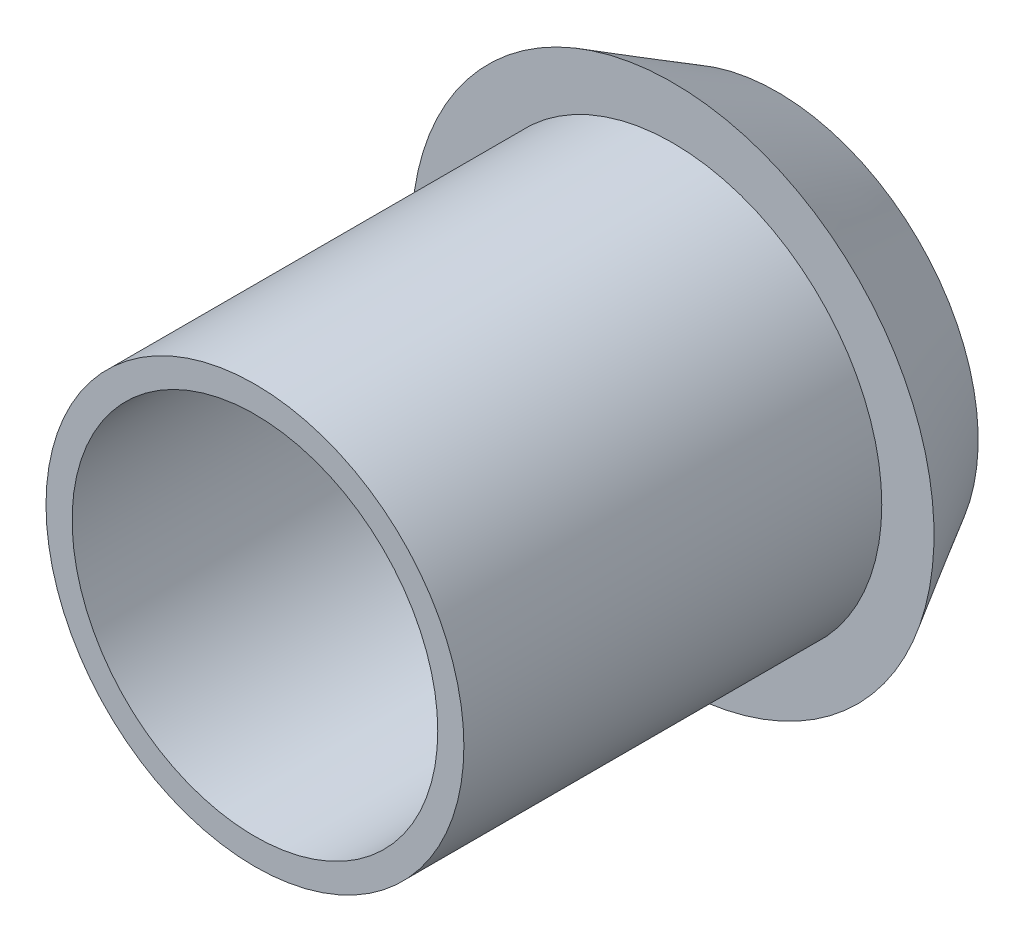
ISO-10303-21;
HEADER;
FILE_DESCRIPTION(('STEP AP214'),'2;1');
FILE_NAME('part.step','',(''),(''),'','','');
FILE_SCHEMA(('AUTOMOTIVE_DESIGN { 1 0 10303 214 1 1 1 1 }'));
ENDSEC;
DATA;
#1=APPLICATION_CONTEXT('core data for automotive mechanical design processes');
#2=APPLICATION_PROTOCOL_DEFINITION('international standard','automotive_design',2000,#1);
#3=PRODUCT_CONTEXT('',#1,'mechanical');
#4=PRODUCT('Part','Part','',(#3));
#5=PRODUCT_RELATED_PRODUCT_CATEGORY('part','',(#4));
#6=PRODUCT_DEFINITION_FORMATION('','',#4);
#7=PRODUCT_DEFINITION_CONTEXT('part definition',#1,'design');
#8=PRODUCT_DEFINITION('design','',#6,#7);
#9=PRODUCT_DEFINITION_SHAPE('','',#8);
#10=(LENGTH_UNIT() NAMED_UNIT(*) SI_UNIT(.MILLI.,.METRE.));
#11=(NAMED_UNIT(*) PLANE_ANGLE_UNIT() SI_UNIT($,.RADIAN.));
#12=(NAMED_UNIT(*) SI_UNIT($,.STERADIAN.) SOLID_ANGLE_UNIT());
#13=UNCERTAINTY_MEASURE_WITH_UNIT(LENGTH_MEASURE(1.E-05),#10,'distance_accuracy_value','');
#14=(GEOMETRIC_REPRESENTATION_CONTEXT(3) GLOBAL_UNCERTAINTY_ASSIGNED_CONTEXT((#13)) GLOBAL_UNIT_ASSIGNED_CONTEXT((#10,
#11,#12)) REPRESENTATION_CONTEXT('',''));
#15=CARTESIAN_POINT('',(0.,0.,0.));
#16=DIRECTION('',(0.,0.,1.));
#17=DIRECTION('',(1.,0.,0.));
#18=AXIS2_PLACEMENT_3D('',#15,#16,#17);
#19=CARTESIAN_POINT('',(0.,0.,8.));
#20=DIRECTION('',(0.,0.,1.));
#21=DIRECTION('',(1.,0.,0.));
#22=AXIS2_PLACEMENT_3D('',#19,#20,#21);
#23=PLANE('',#22);
#24=CARTESIAN_POINT('',(0.,0.,8.));
#25=DIRECTION('',(0.,0.,1.));
#26=DIRECTION('',(1.,0.,0.));
#27=AXIS2_PLACEMENT_3D('',#24,#25,#26);
#28=CIRCLE('',#27,4.);
#29=CARTESIAN_POINT('',(4.,0.,8.));
#30=VERTEX_POINT('',#29);
#31=EDGE_CURVE('E10',#30,#30,#28,.T.);
#32=ORIENTED_EDGE('',*,*,#31,.T.);
#33=EDGE_LOOP('',(#32));
#34=FACE_BOUND('',#33,.T.);
#35=CARTESIAN_POINT('',(0.,0.,8.));
#36=DIRECTION('',(0.,0.,1.));
#37=DIRECTION('',(1.,0.,0.));
#38=AXIS2_PLACEMENT_3D('',#35,#36,#37);
#39=CIRCLE('',#38,3.5);
#40=CARTESIAN_POINT('',(3.5,0.,8.));
#41=VERTEX_POINT('',#40);
#42=EDGE_CURVE('E55',#41,#41,#39,.T.);
#43=ORIENTED_EDGE('',*,*,#42,.F.);
#44=EDGE_LOOP('',(#43));
#45=FACE_BOUND('',#44,.T.);
#46=ADVANCED_FACE('F43',(#34,#45),#23,.T.);
#47=CARTESIAN_POINT('',(0.,0.,8.));
#48=DIRECTION('',(0.,0.,-1.));
#49=DIRECTION('',(-1.,0.,0.));
#50=AXIS2_PLACEMENT_3D('',#47,#48,#49);
#51=CYLINDRICAL_SURFACE('',#50,4.);
#52=ORIENTED_EDGE('',*,*,#31,.F.);
#53=EDGE_LOOP('',(#52));
#54=FACE_BOUND('',#53,.T.);
#55=CARTESIAN_POINT('',(0.,0.,0.));
#56=DIRECTION('',(0.,0.,1.));
#57=DIRECTION('',(1.,0.,0.));
#58=AXIS2_PLACEMENT_3D('',#55,#56,#57);
#59=CIRCLE('',#58,4.);
#60=CARTESIAN_POINT('',(4.,0.,0.));
#61=VERTEX_POINT('',#60);
#62=EDGE_CURVE('E50',#61,#61,#59,.T.);
#63=ORIENTED_EDGE('',*,*,#62,.T.);
#64=EDGE_LOOP('',(#63));
#65=FACE_BOUND('',#64,.T.);
#66=ADVANCED_FACE('F44',(#54,#65),#51,.T.);
#67=CARTESIAN_POINT('',(0.,0.,8.));
#68=DIRECTION('',(0.,0.,-1.));
#69=DIRECTION('',(-1.,0.,0.));
#70=AXIS2_PLACEMENT_3D('',#67,#68,#69);
#71=CYLINDRICAL_SURFACE('',#70,3.5);
#72=ORIENTED_EDGE('',*,*,#42,.T.);
#73=EDGE_LOOP('',(#72));
#74=FACE_BOUND('',#73,.T.);
#75=CARTESIAN_POINT('',(0.,0.,0.));
#76=DIRECTION('',(0.,0.,1.));
#77=DIRECTION('',(1.,0.,0.));
#78=AXIS2_PLACEMENT_3D('',#75,#76,#77);
#79=CIRCLE('',#78,3.5);
#80=CARTESIAN_POINT('',(3.5,0.,0.));
#81=VERTEX_POINT('',#80);
#82=EDGE_CURVE('E60',#81,#81,#79,.T.);
#83=ORIENTED_EDGE('',*,*,#82,.F.);
#84=EDGE_LOOP('',(#83));
#85=FACE_BOUND('',#84,.T.);
#86=ADVANCED_FACE('F88',(#74,#85),#71,.F.);
#87=CARTESIAN_POINT('',(0.,0.,0.));
#88=DIRECTION('',(0.,0.,-1.));
#89=DIRECTION('',(-1.,0.,0.));
#90=AXIS2_PLACEMENT_3D('',#87,#88,#89);
#91=PLANE('',#90);
#92=ORIENTED_EDGE('',*,*,#82,.T.);
#93=EDGE_LOOP('',(#92));
#94=FACE_BOUND('',#93,.T.);
#95=ADVANCED_FACE('F80',(#94),#91,.F.);
#96=CARTESIAN_POINT('',(0.,0.,0.));
#97=DIRECTION('',(0.,0.,1.));
#98=DIRECTION('',(-1.,0.,0.));
#99=AXIS2_PLACEMENT_3D('',#96,#97,#98);
#100=CONICAL_SURFACE('',#99,5.,0.523598775598299);
#101=CARTESIAN_POINT('',(0.,0.,-2.));
#102=DIRECTION('',(0.,0.,-1.));
#103=DIRECTION('',(-1.,0.,0.));
#104=AXIS2_PLACEMENT_3D('',#101,#102,#103);
#105=CIRCLE('',#104,3.84529946162075);
#106=CARTESIAN_POINT('',(-3.84529946162075,0.,-2.));
#107=VERTEX_POINT('',#106);
#108=EDGE_CURVE('E61',#107,#107,#105,.T.);
#109=ORIENTED_EDGE('',*,*,#108,.F.);
#110=EDGE_LOOP('',(#109));
#111=FACE_BOUND('',#110,.T.);
#112=CARTESIAN_POINT('',(0.,0.,0.));
#113=DIRECTION('',(0.,0.,-1.));
#114=DIRECTION('',(-1.,0.,0.));
#115=AXIS2_PLACEMENT_3D('',#112,#113,#114);
#116=CIRCLE('',#115,5.);
#117=CARTESIAN_POINT('',(-5.,0.,0.));
#118=VERTEX_POINT('',#117);
#119=EDGE_CURVE('E70',#118,#118,#116,.T.);
#120=ORIENTED_EDGE('',*,*,#119,.T.);
#121=EDGE_LOOP('',(#120));
#122=FACE_BOUND('',#121,.T.);
#123=ADVANCED_FACE('F75',(#111,#122),#100,.T.);
#124=CARTESIAN_POINT('',(0.,0.,-2.));
#125=DIRECTION('',(0.,0.,-1.));
#126=DIRECTION('',(-1.,0.,0.));
#127=AXIS2_PLACEMENT_3D('',#124,#125,#126);
#128=PLANE('',#127);
#129=ORIENTED_EDGE('',*,*,#108,.T.);
#130=EDGE_LOOP('',(#129));
#131=FACE_BOUND('',#130,.T.);
#132=ADVANCED_FACE('F78',(#131),#128,.T.);
#133=ORIENTED_EDGE('',*,*,#62,.F.);
#134=EDGE_LOOP('',(#133));
#135=FACE_BOUND('',#134,.T.);
#136=ORIENTED_EDGE('',*,*,#119,.F.);
#137=EDGE_LOOP('',(#136));
#138=FACE_BOUND('',#137,.T.);
#139=ADVANCED_FACE('F72',(#135,#138),#91,.F.);
#140=CLOSED_SHELL('',(#46,#66,#86,#95,#123,#132,#139));
#141=MANIFOLD_SOLID_BREP('B2',#140);
#142=ADVANCED_BREP_SHAPE_REPRESENTATION('',(#18,#141),#14);
#143=SHAPE_DEFINITION_REPRESENTATION(#9,#142);
ENDSEC;
END-ISO-10303-21;
